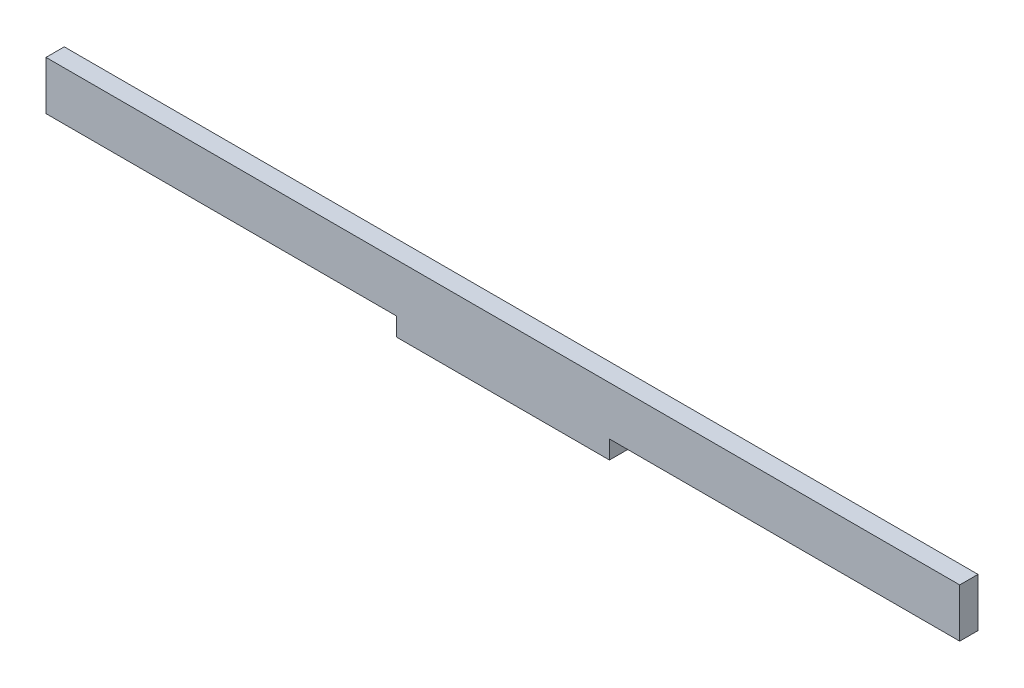
ISO-10303-21;
HEADER;
FILE_DESCRIPTION(('STEP AP214'),'2;1');
FILE_NAME('part.step','',(''),(''),'','','');
FILE_SCHEMA(('AUTOMOTIVE_DESIGN { 1 0 10303 214 1 1 1 1 }'));
ENDSEC;
DATA;
#1=APPLICATION_CONTEXT('core data for automotive mechanical design processes');
#2=APPLICATION_PROTOCOL_DEFINITION('international standard','automotive_design',2000,#1);
#3=PRODUCT_CONTEXT('',#1,'mechanical');
#4=PRODUCT('Part','Part','',(#3));
#5=PRODUCT_RELATED_PRODUCT_CATEGORY('part','',(#4));
#6=PRODUCT_DEFINITION_FORMATION('','',#4);
#7=PRODUCT_DEFINITION_CONTEXT('part definition',#1,'design');
#8=PRODUCT_DEFINITION('design','',#6,#7);
#9=PRODUCT_DEFINITION_SHAPE('','',#8);
#10=(LENGTH_UNIT() NAMED_UNIT(*) SI_UNIT(.MILLI.,.METRE.));
#11=(NAMED_UNIT(*) PLANE_ANGLE_UNIT() SI_UNIT($,.RADIAN.));
#12=(NAMED_UNIT(*) SI_UNIT($,.STERADIAN.) SOLID_ANGLE_UNIT());
#13=UNCERTAINTY_MEASURE_WITH_UNIT(LENGTH_MEASURE(1.E-05),#10,'distance_accuracy_value','');
#14=(GEOMETRIC_REPRESENTATION_CONTEXT(3) GLOBAL_UNCERTAINTY_ASSIGNED_CONTEXT((#13)) GLOBAL_UNIT_ASSIGNED_CONTEXT((#10,
#11,#12)) REPRESENTATION_CONTEXT('',''));
#15=CARTESIAN_POINT('',(0.,0.,0.));
#16=DIRECTION('',(0.,0.,1.));
#17=DIRECTION('',(1.,0.,0.));
#18=AXIS2_PLACEMENT_3D('',#15,#16,#17);
#19=CARTESIAN_POINT('',(-123.078677966903,2.69175549345001,3.));
#20=DIRECTION('',(1.,0.,0.));
#21=DIRECTION('',(0.,0.,-1.));
#22=AXIS2_PLACEMENT_3D('',#19,#20,#21);
#23=PLANE('',#22);
#24=DIRECTION('',(0.,-1.,0.));
#25=VECTOR('',#24,1.);
#26=CARTESIAN_POINT('',(-123.078677966903,2.69175549345001,0.));
#27=LINE('',#26,#25);
#28=CARTESIAN_POINT('',(-123.078677966903,2.69175549345001,0.));
#29=VERTEX_POINT('',#28);
#30=CARTESIAN_POINT('',(-123.078677966903,-5.30824450654999,0.));
#31=VERTEX_POINT('',#30);
#32=EDGE_CURVE('E129',#29,#31,#27,.T.);
#33=ORIENTED_EDGE('',*,*,#32,.T.);
#34=DIRECTION('',(0.,0.,-1.));
#35=VECTOR('',#34,1.);
#36=CARTESIAN_POINT('',(-123.078677966903,-5.30824450654999,3.));
#37=LINE('',#36,#35);
#38=CARTESIAN_POINT('',(-123.078677966903,-5.30824450654999,3.));
#39=VERTEX_POINT('',#38);
#40=EDGE_CURVE('E11',#39,#31,#37,.T.);
#41=ORIENTED_EDGE('',*,*,#40,.F.);
#42=DIRECTION('',(0.,-1.,0.));
#43=VECTOR('',#42,1.);
#44=CARTESIAN_POINT('',(-123.078677966903,2.69175549345001,3.));
#45=LINE('',#44,#43);
#46=CARTESIAN_POINT('',(-123.078677966903,2.69175549345001,3.));
#47=VERTEX_POINT('',#46);
#48=EDGE_CURVE('E143',#47,#39,#45,.T.);
#49=ORIENTED_EDGE('',*,*,#48,.F.);
#50=DIRECTION('',(0.,0.,-1.));
#51=VECTOR('',#50,1.);
#52=CARTESIAN_POINT('',(-123.078677966903,2.69175549345001,3.));
#53=LINE('',#52,#51);
#54=EDGE_CURVE('E125',#47,#29,#53,.T.);
#55=ORIENTED_EDGE('',*,*,#54,.T.);
#56=EDGE_LOOP('',(#33,#41,#49,#55));
#57=FACE_BOUND('',#56,.T.);
#58=ADVANCED_FACE('F33',(#57),#23,.F.);
#59=CARTESIAN_POINT('',(-123.078677966903,-5.30824450654999,3.));
#60=DIRECTION('',(0.,1.,0.));
#61=DIRECTION('',(0.,0.,1.));
#62=AXIS2_PLACEMENT_3D('',#59,#60,#61);
#63=PLANE('',#62);
#64=DIRECTION('',(1.,0.,0.));
#65=VECTOR('',#64,1.);
#66=CARTESIAN_POINT('',(-123.078677966903,-5.30824450654999,0.));
#67=LINE('',#66,#65);
#68=CARTESIAN_POINT('',(-65.5786779669027,-5.30824450654999,0.));
#69=VERTEX_POINT('',#68);
#70=EDGE_CURVE('E132',#31,#69,#67,.T.);
#71=ORIENTED_EDGE('',*,*,#70,.T.);
#72=DIRECTION('',(0.,0.,-1.));
#73=VECTOR('',#72,1.);
#74=CARTESIAN_POINT('',(-65.5786779669027,-5.30824450654999,3.));
#75=LINE('',#74,#73);
#76=CARTESIAN_POINT('',(-65.5786779669027,-5.30824450654999,3.));
#77=VERTEX_POINT('',#76);
#78=EDGE_CURVE('E41',#77,#69,#75,.T.);
#79=ORIENTED_EDGE('',*,*,#78,.F.);
#80=DIRECTION('',(1.,0.,0.));
#81=VECTOR('',#80,1.);
#82=CARTESIAN_POINT('',(-123.078677966903,-5.30824450654999,3.));
#83=LINE('',#82,#81);
#84=EDGE_CURVE('E92',#39,#77,#83,.T.);
#85=ORIENTED_EDGE('',*,*,#84,.F.);
#86=ORIENTED_EDGE('',*,*,#40,.T.);
#87=EDGE_LOOP('',(#71,#79,#85,#86));
#88=FACE_BOUND('',#87,.T.);
#89=ADVANCED_FACE('F178',(#88),#63,.F.);
#90=CARTESIAN_POINT('',(-65.5786779669027,-5.30824450654999,3.));
#91=DIRECTION('',(1.,0.,0.));
#92=DIRECTION('',(0.,0.,-1.));
#93=AXIS2_PLACEMENT_3D('',#90,#91,#92);
#94=PLANE('',#93);
#95=DIRECTION('',(0.,-1.,0.));
#96=VECTOR('',#95,1.);
#97=CARTESIAN_POINT('',(-65.5786779669027,-5.30824450654999,0.));
#98=LINE('',#97,#96);
#99=CARTESIAN_POINT('',(-65.5786779669027,-8.30824450654999,0.));
#100=VERTEX_POINT('',#99);
#101=EDGE_CURVE('E134',#69,#100,#98,.T.);
#102=ORIENTED_EDGE('',*,*,#101,.T.);
#103=DIRECTION('',(0.,0.,-1.));
#104=VECTOR('',#103,1.);
#105=CARTESIAN_POINT('',(-65.5786779669027,-8.30824450654999,3.));
#106=LINE('',#105,#104);
#107=CARTESIAN_POINT('',(-65.5786779669027,-8.30824450654999,3.));
#108=VERTEX_POINT('',#107);
#109=EDGE_CURVE('E150',#108,#100,#106,.T.);
#110=ORIENTED_EDGE('',*,*,#109,.F.);
#111=DIRECTION('',(0.,-1.,0.));
#112=VECTOR('',#111,1.);
#113=CARTESIAN_POINT('',(-65.5786779669027,-5.30824450654999,3.));
#114=LINE('',#113,#112);
#115=EDGE_CURVE('E158',#77,#108,#114,.T.);
#116=ORIENTED_EDGE('',*,*,#115,.F.);
#117=ORIENTED_EDGE('',*,*,#78,.T.);
#118=EDGE_LOOP('',(#102,#110,#116,#117));
#119=FACE_BOUND('',#118,.T.);
#120=ADVANCED_FACE('F156',(#119),#94,.F.);
#121=CARTESIAN_POINT('',(-65.5786779669027,-8.30824450654999,3.));
#122=DIRECTION('',(0.,1.,0.));
#123=DIRECTION('',(-1.,0.,0.));
#124=AXIS2_PLACEMENT_3D('',#121,#122,#123);
#125=PLANE('',#124);
#126=DIRECTION('',(1.,0.,0.));
#127=VECTOR('',#126,1.);
#128=CARTESIAN_POINT('',(-65.5786779669027,-8.30824450654999,0.));
#129=LINE('',#128,#127);
#130=CARTESIAN_POINT('',(-30.5786779669027,-8.30824450654999,0.));
#131=VERTEX_POINT('',#130);
#132=EDGE_CURVE('E136',#100,#131,#129,.T.);
#133=ORIENTED_EDGE('',*,*,#132,.T.);
#134=DIRECTION('',(0.,0.,-1.));
#135=VECTOR('',#134,1.);
#136=CARTESIAN_POINT('',(-30.5786779669027,-8.30824450654999,3.));
#137=LINE('',#136,#135);
#138=CARTESIAN_POINT('',(-30.5786779669027,-8.30824450654999,3.));
#139=VERTEX_POINT('',#138);
#140=EDGE_CURVE('E147',#139,#131,#137,.T.);
#141=ORIENTED_EDGE('',*,*,#140,.F.);
#142=DIRECTION('',(1.,0.,0.));
#143=VECTOR('',#142,1.);
#144=CARTESIAN_POINT('',(-65.5786779669027,-8.30824450654999,3.));
#145=LINE('',#144,#143);
#146=EDGE_CURVE('E170',#108,#139,#145,.T.);
#147=ORIENTED_EDGE('',*,*,#146,.F.);
#148=ORIENTED_EDGE('',*,*,#109,.T.);
#149=EDGE_LOOP('',(#133,#141,#147,#148));
#150=FACE_BOUND('',#149,.T.);
#151=ADVANCED_FACE('F166',(#150),#125,.F.);
#152=CARTESIAN_POINT('',(-30.5786779669027,-5.30824450654999,3.));
#153=DIRECTION('',(-1.,0.,0.));
#154=DIRECTION('',(0.,0.,1.));
#155=AXIS2_PLACEMENT_3D('',#152,#153,#154);
#156=PLANE('',#155);
#157=DIRECTION('',(0.,1.,0.));
#158=VECTOR('',#157,1.);
#159=CARTESIAN_POINT('',(-30.5786779669027,-5.30824450654999,0.));
#160=LINE('',#159,#158);
#161=CARTESIAN_POINT('',(-30.5786779669027,-5.30824450654999,0.));
#162=VERTEX_POINT('',#161);
#163=EDGE_CURVE('E138',#131,#162,#160,.T.);
#164=ORIENTED_EDGE('',*,*,#163,.T.);
#165=DIRECTION('',(0.,0.,-1.));
#166=VECTOR('',#165,1.);
#167=CARTESIAN_POINT('',(-30.5786779669027,-5.30824450654999,3.));
#168=LINE('',#167,#166);
#169=CARTESIAN_POINT('',(-30.5786779669027,-5.30824450654999,3.));
#170=VERTEX_POINT('',#169);
#171=EDGE_CURVE('E120',#170,#162,#168,.T.);
#172=ORIENTED_EDGE('',*,*,#171,.F.);
#173=DIRECTION('',(0.,1.,0.));
#174=VECTOR('',#173,1.);
#175=CARTESIAN_POINT('',(-30.5786779669027,-5.30824450654999,3.));
#176=LINE('',#175,#174);
#177=EDGE_CURVE('E111',#139,#170,#176,.T.);
#178=ORIENTED_EDGE('',*,*,#177,.F.);
#179=ORIENTED_EDGE('',*,*,#140,.T.);
#180=EDGE_LOOP('',(#164,#172,#178,#179));
#181=FACE_BOUND('',#180,.T.);
#182=ADVANCED_FACE('F169',(#181),#156,.F.);
#183=CARTESIAN_POINT('',(-30.5786779669027,-5.30824450654999,3.));
#184=DIRECTION('',(0.,1.,0.));
#185=DIRECTION('',(0.,0.,1.));
#186=AXIS2_PLACEMENT_3D('',#183,#184,#185);
#187=PLANE('',#186);
#188=DIRECTION('',(1.,0.,0.));
#189=VECTOR('',#188,1.);
#190=CARTESIAN_POINT('',(-30.5786779669027,-5.30824450654999,0.));
#191=LINE('',#190,#189);
#192=CARTESIAN_POINT('',(26.9213220330973,-5.30824450654999,0.));
#193=VERTEX_POINT('',#192);
#194=EDGE_CURVE('E119',#162,#193,#191,.T.);
#195=ORIENTED_EDGE('',*,*,#194,.T.);
#196=DIRECTION('',(0.,0.,-1.));
#197=VECTOR('',#196,1.);
#198=CARTESIAN_POINT('',(26.9213220330973,-5.30824450654999,3.));
#199=LINE('',#198,#197);
#200=CARTESIAN_POINT('',(26.9213220330973,-5.30824450654999,3.));
#201=VERTEX_POINT('',#200);
#202=EDGE_CURVE('E116',#201,#193,#199,.T.);
#203=ORIENTED_EDGE('',*,*,#202,.F.);
#204=DIRECTION('',(1.,0.,0.));
#205=VECTOR('',#204,1.);
#206=CARTESIAN_POINT('',(-30.5786779669027,-5.30824450654999,3.));
#207=LINE('',#206,#205);
#208=EDGE_CURVE('E105',#170,#201,#207,.T.);
#209=ORIENTED_EDGE('',*,*,#208,.F.);
#210=ORIENTED_EDGE('',*,*,#171,.T.);
#211=EDGE_LOOP('',(#195,#203,#209,#210));
#212=FACE_BOUND('',#211,.T.);
#213=ADVANCED_FACE('F117',(#212),#187,.F.);
#214=CARTESIAN_POINT('',(26.9213220330973,2.69175549345001,3.));
#215=DIRECTION('',(-1.,0.,0.));
#216=DIRECTION('',(0.,0.,1.));
#217=AXIS2_PLACEMENT_3D('',#214,#215,#216);
#218=PLANE('',#217);
#219=DIRECTION('',(0.,1.,0.));
#220=VECTOR('',#219,1.);
#221=CARTESIAN_POINT('',(26.9213220330973,2.69175549345001,0.));
#222=LINE('',#221,#220);
#223=CARTESIAN_POINT('',(26.9213220330973,2.69175549345001,0.));
#224=VERTEX_POINT('',#223);
#225=EDGE_CURVE('E78',#193,#224,#222,.T.);
#226=ORIENTED_EDGE('',*,*,#225,.T.);
#227=DIRECTION('',(0.,0.,-1.));
#228=VECTOR('',#227,1.);
#229=CARTESIAN_POINT('',(26.9213220330973,2.69175549345001,3.));
#230=LINE('',#229,#228);
#231=CARTESIAN_POINT('',(26.9213220330973,2.69175549345001,3.));
#232=VERTEX_POINT('',#231);
#233=EDGE_CURVE('E121',#232,#224,#230,.T.);
#234=ORIENTED_EDGE('',*,*,#233,.F.);
#235=DIRECTION('',(0.,1.,0.));
#236=VECTOR('',#235,1.);
#237=CARTESIAN_POINT('',(26.9213220330973,2.69175549345001,3.));
#238=LINE('',#237,#236);
#239=EDGE_CURVE('E109',#201,#232,#238,.T.);
#240=ORIENTED_EDGE('',*,*,#239,.F.);
#241=ORIENTED_EDGE('',*,*,#202,.T.);
#242=EDGE_LOOP('',(#226,#234,#240,#241));
#243=FACE_BOUND('',#242,.T.);
#244=ADVANCED_FACE('F123',(#243),#218,.F.);
#245=CARTESIAN_POINT('',(-123.078677966903,2.69175549345001,3.));
#246=DIRECTION('',(0.,-1.,0.));
#247=DIRECTION('',(0.,0.,-1.));
#248=AXIS2_PLACEMENT_3D('',#245,#246,#247);
#249=PLANE('',#248);
#250=DIRECTION('',(-1.,0.,0.));
#251=VECTOR('',#250,1.);
#252=CARTESIAN_POINT('',(-123.078677966903,2.69175549345001,0.));
#253=LINE('',#252,#251);
#254=EDGE_CURVE('E84',#224,#29,#253,.T.);
#255=ORIENTED_EDGE('',*,*,#254,.T.);
#256=ORIENTED_EDGE('',*,*,#54,.F.);
#257=DIRECTION('',(-1.,0.,0.));
#258=VECTOR('',#257,1.);
#259=CARTESIAN_POINT('',(-123.078677966903,2.69175549345001,3.));
#260=LINE('',#259,#258);
#261=EDGE_CURVE('E49',#232,#47,#260,.T.);
#262=ORIENTED_EDGE('',*,*,#261,.F.);
#263=ORIENTED_EDGE('',*,*,#233,.T.);
#264=EDGE_LOOP('',(#255,#256,#262,#263));
#265=FACE_BOUND('',#264,.T.);
#266=ADVANCED_FACE('F194',(#265),#249,.F.);
#267=CARTESIAN_POINT('',(0.,0.,3.));
#268=DIRECTION('',(0.,0.,1.));
#269=DIRECTION('',(1.,0.,0.));
#270=AXIS2_PLACEMENT_3D('',#267,#268,#269);
#271=PLANE('',#270);
#272=ORIENTED_EDGE('',*,*,#48,.T.);
#273=ORIENTED_EDGE('',*,*,#84,.T.);
#274=ORIENTED_EDGE('',*,*,#115,.T.);
#275=ORIENTED_EDGE('',*,*,#146,.T.);
#276=ORIENTED_EDGE('',*,*,#177,.T.);
#277=ORIENTED_EDGE('',*,*,#208,.T.);
#278=ORIENTED_EDGE('',*,*,#239,.T.);
#279=ORIENTED_EDGE('',*,*,#261,.T.);
#280=EDGE_LOOP('',(#272,#273,#274,#275,#276,#277,#278,#279));
#281=FACE_BOUND('',#280,.T.);
#282=ADVANCED_FACE('F107',(#281),#271,.T.);
#283=CARTESIAN_POINT('',(0.,0.,0.));
#284=DIRECTION('',(0.,0.,1.));
#285=DIRECTION('',(1.,0.,0.));
#286=AXIS2_PLACEMENT_3D('',#283,#284,#285);
#287=PLANE('',#286);
#288=ORIENTED_EDGE('',*,*,#32,.F.);
#289=ORIENTED_EDGE('',*,*,#254,.F.);
#290=ORIENTED_EDGE('',*,*,#225,.F.);
#291=ORIENTED_EDGE('',*,*,#194,.F.);
#292=ORIENTED_EDGE('',*,*,#163,.F.);
#293=ORIENTED_EDGE('',*,*,#132,.F.);
#294=ORIENTED_EDGE('',*,*,#101,.F.);
#295=ORIENTED_EDGE('',*,*,#70,.F.);
#296=EDGE_LOOP('',(#288,#289,#290,#291,#292,#293,#294,#295));
#297=FACE_BOUND('',#296,.T.);
#298=ADVANCED_FACE('F162',(#297),#287,.F.);
#299=CLOSED_SHELL('',(#58,#89,#120,#151,#182,#213,#244,#266,#282,#298));
#300=MANIFOLD_SOLID_BREP('B2',#299);
#301=ADVANCED_BREP_SHAPE_REPRESENTATION('',(#18,#300),#14);
#302=SHAPE_DEFINITION_REPRESENTATION(#9,#301);
ENDSEC;
END-ISO-10303-21;
